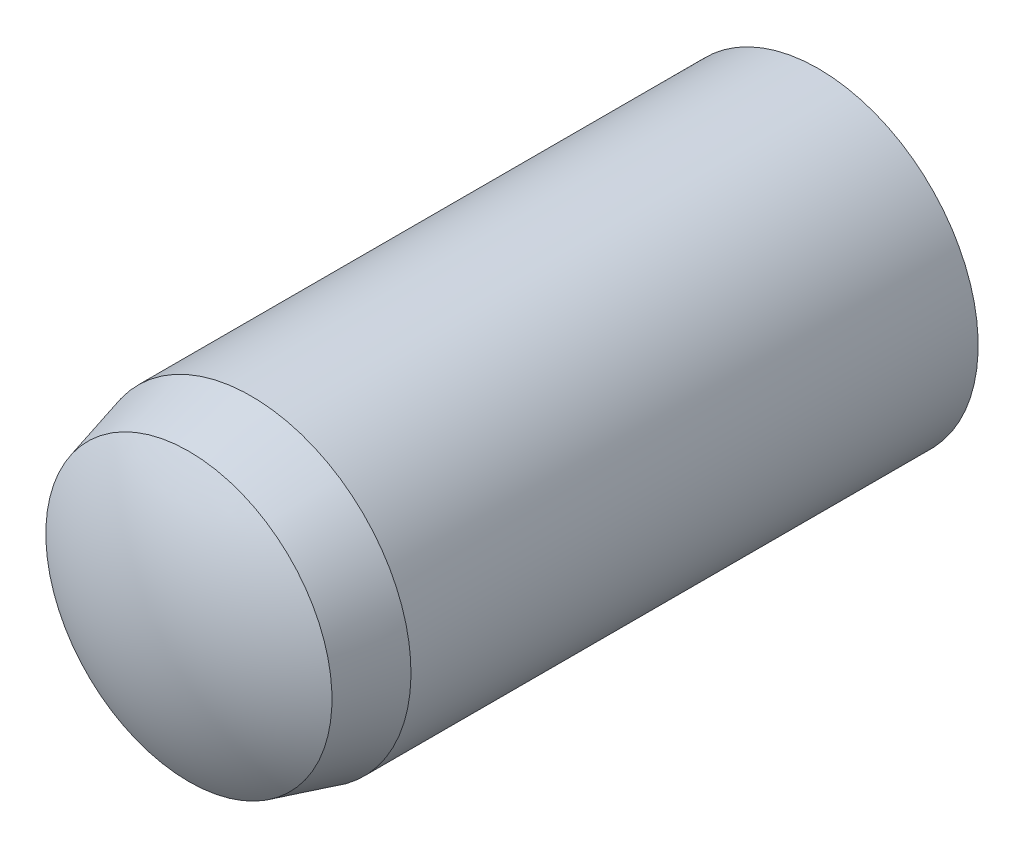
ISO-10303-21;
HEADER;
FILE_DESCRIPTION(('STEP AP214'),'2;1');
FILE_NAME('part.step','',(''),(''),'','','');
FILE_SCHEMA(('AUTOMOTIVE_DESIGN { 1 0 10303 214 1 1 1 1 }'));
ENDSEC;
DATA;
#1=APPLICATION_CONTEXT('core data for automotive mechanical design processes');
#2=APPLICATION_PROTOCOL_DEFINITION('international standard','automotive_design',2000,#1);
#3=PRODUCT_CONTEXT('',#1,'mechanical');
#4=PRODUCT('Part','Part','',(#3));
#5=PRODUCT_RELATED_PRODUCT_CATEGORY('part','',(#4));
#6=PRODUCT_DEFINITION_FORMATION('','',#4);
#7=PRODUCT_DEFINITION_CONTEXT('part definition',#1,'design');
#8=PRODUCT_DEFINITION('design','',#6,#7);
#9=PRODUCT_DEFINITION_SHAPE('','',#8);
#10=(LENGTH_UNIT() NAMED_UNIT(*) SI_UNIT(.MILLI.,.METRE.));
#11=(NAMED_UNIT(*) PLANE_ANGLE_UNIT() SI_UNIT($,.RADIAN.));
#12=(NAMED_UNIT(*) SI_UNIT($,.STERADIAN.) SOLID_ANGLE_UNIT());
#13=UNCERTAINTY_MEASURE_WITH_UNIT(LENGTH_MEASURE(1.E-05),#10,'distance_accuracy_value','');
#14=(GEOMETRIC_REPRESENTATION_CONTEXT(3) GLOBAL_UNCERTAINTY_ASSIGNED_CONTEXT((#13)) GLOBAL_UNIT_ASSIGNED_CONTEXT((#10,
#11,#12)) REPRESENTATION_CONTEXT('',''));
#15=CARTESIAN_POINT('',(0.,0.,0.));
#16=DIRECTION('',(0.,0.,1.));
#17=DIRECTION('',(1.,0.,0.));
#18=AXIS2_PLACEMENT_3D('',#15,#16,#17);
#19=CARTESIAN_POINT('',(0.,0.,-1.73333333333333));
#20=DIRECTION('',(0.,0.,1.));
#21=DIRECTION('',(0.,1.,0.));
#22=AXIS2_PLACEMENT_3D('',#19,#20,#21);
#23=SPHERICAL_SURFACE('',#22,7.26666666666667);
#24=CARTESIAN_POINT('',(0.,0.,-7.8));
#25=DIRECTION('',(0.,0.,1.));
#26=DIRECTION('',(0.,-1.,0.));
#27=AXIS2_PLACEMENT_3D('',#24,#25,#26);
#28=CIRCLE('',#27,4.);
#29=CARTESIAN_POINT('',(0.,-4.,-7.8));
#30=VERTEX_POINT('',#29);
#31=EDGE_CURVE('E10',#30,#30,#28,.T.);
#32=ORIENTED_EDGE('',*,*,#31,.F.);
#33=EDGE_LOOP('',(#32));
#34=FACE_BOUND('',#33,.T.);
#35=ADVANCED_FACE('F39',(#34),#23,.T.);
#36=CARTESIAN_POINT('',(0.,0.,9.));
#37=DIRECTION('',(0.,0.,1.));
#38=DIRECTION('',(0.,-1.,0.));
#39=AXIS2_PLACEMENT_3D('',#36,#37,#38);
#40=CYLINDRICAL_SURFACE('',#39,4.);
#41=CARTESIAN_POINT('',(0.,0.,6.4));
#42=DIRECTION('',(0.,0.,1.));
#43=DIRECTION('',(0.,-1.,0.));
#44=AXIS2_PLACEMENT_3D('',#41,#42,#43);
#45=CIRCLE('',#44,4.);
#46=CARTESIAN_POINT('',(0.,-4.,6.4));
#47=VERTEX_POINT('',#46);
#48=EDGE_CURVE('E46',#47,#47,#45,.T.);
#49=ORIENTED_EDGE('',*,*,#48,.F.);
#50=EDGE_LOOP('',(#49));
#51=FACE_BOUND('',#50,.T.);
#52=ORIENTED_EDGE('',*,*,#31,.T.);
#53=EDGE_LOOP('',(#52));
#54=FACE_BOUND('',#53,.T.);
#55=ADVANCED_FACE('F66',(#51,#54),#40,.T.);
#56=CARTESIAN_POINT('',(0.,0.,6.4));
#57=DIRECTION('',(0.,0.,-1.));
#58=DIRECTION('',(0.,1.,0.));
#59=AXIS2_PLACEMENT_3D('',#56,#57,#58);
#60=CONICAL_SURFACE('',#59,4.,0.26179938779915);
#61=CARTESIAN_POINT('',(0.,0.,7.96));
#62=DIRECTION('',(0.,0.,1.));
#63=DIRECTION('',(0.,-1.,0.));
#64=AXIS2_PLACEMENT_3D('',#61,#62,#63);
#65=CIRCLE('',#64,3.58199925980745);
#66=CARTESIAN_POINT('',(0.,-3.58199925980745,7.96));
#67=VERTEX_POINT('',#66);
#68=EDGE_CURVE('E52',#67,#67,#65,.T.);
#69=ORIENTED_EDGE('',*,*,#68,.F.);
#70=EDGE_LOOP('',(#69));
#71=FACE_BOUND('',#70,.T.);
#72=ORIENTED_EDGE('',*,*,#48,.T.);
#73=EDGE_LOOP('',(#72));
#74=FACE_BOUND('',#73,.T.);
#75=ADVANCED_FACE('F64',(#71,#74),#60,.T.);
#76=CARTESIAN_POINT('',(0.,0.,2.31138524170139));
#77=DIRECTION('',(0.,0.,1.));
#78=DIRECTION('',(0.,1.,0.));
#79=AXIS2_PLACEMENT_3D('',#76,#77,#78);
#80=SPHERICAL_SURFACE('',#79,6.68861475829861);
#81=ORIENTED_EDGE('',*,*,#68,.T.);
#82=EDGE_LOOP('',(#81));
#83=FACE_BOUND('',#82,.T.);
#84=ADVANCED_FACE('F62',(#83),#80,.T.);
#85=CLOSED_SHELL('',(#35,#55,#75,#84));
#86=MANIFOLD_SOLID_BREP('B2',#85);
#87=ADVANCED_BREP_SHAPE_REPRESENTATION('',(#18,#86),#14);
#88=SHAPE_DEFINITION_REPRESENTATION(#9,#87);
ENDSEC;
END-ISO-10303-21;
